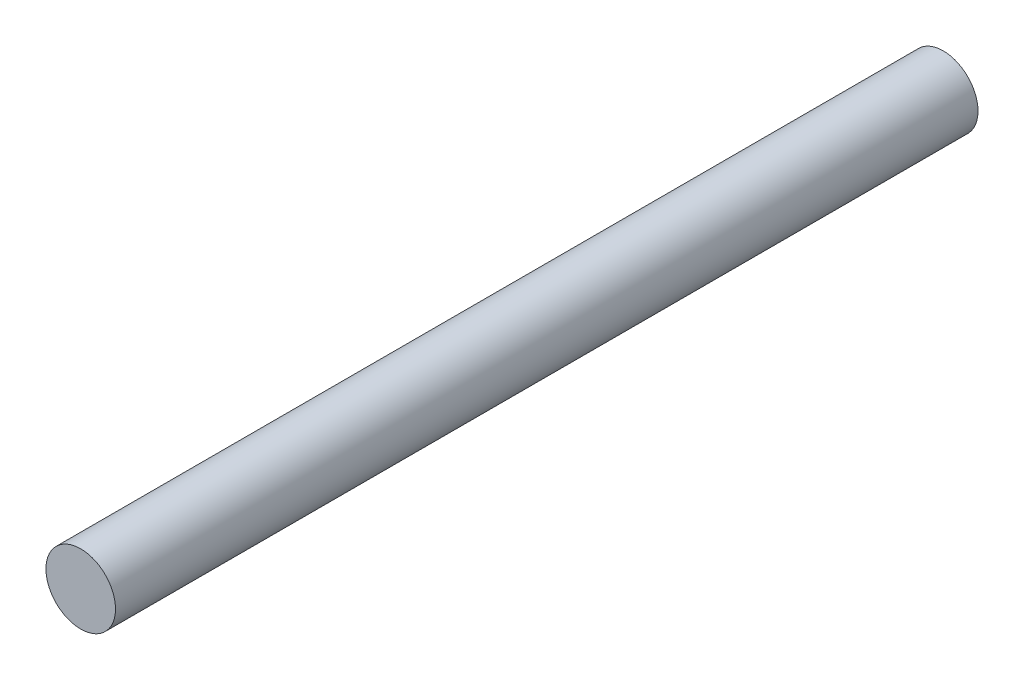
ISO-10303-21;
HEADER;
FILE_DESCRIPTION(('STEP AP214'),'2;1');
FILE_NAME('part.step','',(''),(''),'','','');
FILE_SCHEMA(('AUTOMOTIVE_DESIGN { 1 0 10303 214 1 1 1 1 }'));
ENDSEC;
DATA;
#1=APPLICATION_CONTEXT('core data for automotive mechanical design processes');
#2=APPLICATION_PROTOCOL_DEFINITION('international standard','automotive_design',2000,#1);
#3=PRODUCT_CONTEXT('',#1,'mechanical');
#4=PRODUCT('Part','Part','',(#3));
#5=PRODUCT_RELATED_PRODUCT_CATEGORY('part','',(#4));
#6=PRODUCT_DEFINITION_FORMATION('','',#4);
#7=PRODUCT_DEFINITION_CONTEXT('part definition',#1,'design');
#8=PRODUCT_DEFINITION('design','',#6,#7);
#9=PRODUCT_DEFINITION_SHAPE('','',#8);
#10=(LENGTH_UNIT() NAMED_UNIT(*) SI_UNIT(.MILLI.,.METRE.));
#11=(NAMED_UNIT(*) PLANE_ANGLE_UNIT() SI_UNIT($,.RADIAN.));
#12=(NAMED_UNIT(*) SI_UNIT($,.STERADIAN.) SOLID_ANGLE_UNIT());
#13=UNCERTAINTY_MEASURE_WITH_UNIT(LENGTH_MEASURE(1.E-05),#10,'distance_accuracy_value','');
#14=(GEOMETRIC_REPRESENTATION_CONTEXT(3) GLOBAL_UNCERTAINTY_ASSIGNED_CONTEXT((#13)) GLOBAL_UNIT_ASSIGNED_CONTEXT((#10,
#11,#12)) REPRESENTATION_CONTEXT('',''));
#15=CARTESIAN_POINT('',(0.,0.,0.));
#16=DIRECTION('',(0.,0.,1.));
#17=DIRECTION('',(1.,0.,0.));
#18=AXIS2_PLACEMENT_3D('',#15,#16,#17);
#19=CARTESIAN_POINT('',(0.,0.,310.));
#20=DIRECTION('',(0.,0.,-1.));
#21=DIRECTION('',(-1.,0.,0.));
#22=AXIS2_PLACEMENT_3D('',#19,#20,#21);
#23=CYLINDRICAL_SURFACE('',#22,12.5);
#24=CARTESIAN_POINT('',(0.,0.,310.));
#25=DIRECTION('',(0.,0.,1.));
#26=DIRECTION('',(1.,0.,0.));
#27=AXIS2_PLACEMENT_3D('',#24,#25,#26);
#28=CIRCLE('',#27,12.5);
#29=CARTESIAN_POINT('',(12.5,0.,310.));
#30=VERTEX_POINT('',#29);
#31=EDGE_CURVE('E10',#30,#30,#28,.T.);
#32=ORIENTED_EDGE('',*,*,#31,.F.);
#33=EDGE_LOOP('',(#32));
#34=FACE_BOUND('',#33,.T.);
#35=CARTESIAN_POINT('',(0.,0.,0.));
#36=DIRECTION('',(0.,0.,1.));
#37=DIRECTION('',(1.,0.,0.));
#38=AXIS2_PLACEMENT_3D('',#35,#36,#37);
#39=CIRCLE('',#38,12.5);
#40=CARTESIAN_POINT('',(12.5,0.,0.));
#41=VERTEX_POINT('',#40);
#42=EDGE_CURVE('E34',#41,#41,#39,.T.);
#43=ORIENTED_EDGE('',*,*,#42,.T.);
#44=EDGE_LOOP('',(#43));
#45=FACE_BOUND('',#44,.T.);
#46=ADVANCED_FACE('F31',(#34,#45),#23,.T.);
#47=CARTESIAN_POINT('',(0.,0.,310.));
#48=DIRECTION('',(0.,0.,1.));
#49=DIRECTION('',(1.,0.,0.));
#50=AXIS2_PLACEMENT_3D('',#47,#48,#49);
#51=PLANE('',#50);
#52=ORIENTED_EDGE('',*,*,#31,.T.);
#53=EDGE_LOOP('',(#52));
#54=FACE_BOUND('',#53,.T.);
#55=ADVANCED_FACE('F46',(#54),#51,.T.);
#56=CARTESIAN_POINT('',(0.,0.,0.));
#57=DIRECTION('',(0.,0.,1.));
#58=DIRECTION('',(1.,0.,0.));
#59=AXIS2_PLACEMENT_3D('',#56,#57,#58);
#60=PLANE('',#59);
#61=ORIENTED_EDGE('',*,*,#42,.F.);
#62=EDGE_LOOP('',(#61));
#63=FACE_BOUND('',#62,.T.);
#64=ADVANCED_FACE('F44',(#63),#60,.F.);
#65=CLOSED_SHELL('',(#46,#55,#64));
#66=MANIFOLD_SOLID_BREP('B2',#65);
#67=ADVANCED_BREP_SHAPE_REPRESENTATION('',(#18,#66),#14);
#68=SHAPE_DEFINITION_REPRESENTATION(#9,#67);
ENDSEC;
END-ISO-10303-21;
